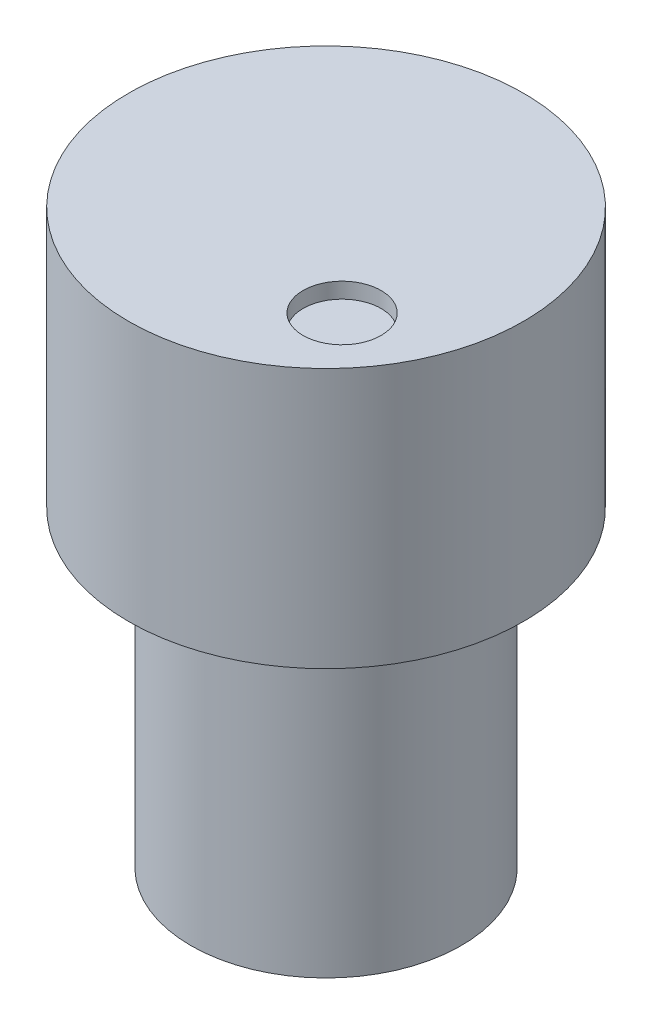
ISO-10303-21;
HEADER;
FILE_DESCRIPTION(('STEP AP214'),'2;1');
FILE_NAME('part.step','',(''),(''),'','','');
FILE_SCHEMA(('AUTOMOTIVE_DESIGN { 1 0 10303 214 1 1 1 1 }'));
ENDSEC;
DATA;
#1=APPLICATION_CONTEXT('core data for automotive mechanical design processes');
#2=APPLICATION_PROTOCOL_DEFINITION('international standard','automotive_design',2000,#1);
#3=PRODUCT_CONTEXT('',#1,'mechanical');
#4=PRODUCT('Part','Part','',(#3));
#5=PRODUCT_RELATED_PRODUCT_CATEGORY('part','',(#4));
#6=PRODUCT_DEFINITION_FORMATION('','',#4);
#7=PRODUCT_DEFINITION_CONTEXT('part definition',#1,'design');
#8=PRODUCT_DEFINITION('design','',#6,#7);
#9=PRODUCT_DEFINITION_SHAPE('','',#8);
#10=(LENGTH_UNIT() NAMED_UNIT(*) SI_UNIT(.MILLI.,.METRE.));
#11=(NAMED_UNIT(*) PLANE_ANGLE_UNIT() SI_UNIT($,.RADIAN.));
#12=(NAMED_UNIT(*) SI_UNIT($,.STERADIAN.) SOLID_ANGLE_UNIT());
#13=UNCERTAINTY_MEASURE_WITH_UNIT(LENGTH_MEASURE(1.E-05),#10,'distance_accuracy_value','');
#14=(GEOMETRIC_REPRESENTATION_CONTEXT(3) GLOBAL_UNCERTAINTY_ASSIGNED_CONTEXT((#13)) GLOBAL_UNIT_ASSIGNED_CONTEXT((#10,
#11,#12)) REPRESENTATION_CONTEXT('',''));
#15=CARTESIAN_POINT('',(0.,0.,0.));
#16=DIRECTION('',(0.,0.,1.));
#17=DIRECTION('',(1.,0.,0.));
#18=AXIS2_PLACEMENT_3D('',#15,#16,#17);
#19=CARTESIAN_POINT('',(0.,0.,0.));
#20=DIRECTION('',(0.,1.,0.));
#21=DIRECTION('',(0.,0.,1.));
#22=AXIS2_PLACEMENT_3D('',#19,#20,#21);
#23=PLANE('',#22);
#24=CARTESIAN_POINT('',(0.,0.,0.));
#25=DIRECTION('',(0.,1.,0.));
#26=DIRECTION('',(0.,0.,1.));
#27=AXIS2_PLACEMENT_3D('',#24,#25,#26);
#28=CIRCLE('',#27,5.2);
#29=CARTESIAN_POINT('',(0.,0.,5.2));
#30=VERTEX_POINT('',#29);
#31=EDGE_CURVE('E40',#30,#30,#28,.T.);
#32=ORIENTED_EDGE('',*,*,#31,.F.);
#33=EDGE_LOOP('',(#32));
#34=FACE_BOUND('',#33,.T.);
#35=CARTESIAN_POINT('',(0.,0.,0.));
#36=DIRECTION('',(0.,1.,0.));
#37=DIRECTION('',(0.,0.,1.));
#38=AXIS2_PLACEMENT_3D('',#35,#36,#37);
#39=CIRCLE('',#38,3.2);
#40=CARTESIAN_POINT('',(0.,0.,3.2));
#41=VERTEX_POINT('',#40);
#42=EDGE_CURVE('E80',#41,#41,#39,.T.);
#43=ORIENTED_EDGE('',*,*,#42,.T.);
#44=EDGE_LOOP('',(#43));
#45=FACE_BOUND('',#44,.T.);
#46=ADVANCED_FACE('F36',(#34,#45),#23,.F.);
#47=CARTESIAN_POINT('',(0.,12.,0.));
#48=DIRECTION('',(0.,-1.,0.));
#49=DIRECTION('',(0.,0.,-1.));
#50=AXIS2_PLACEMENT_3D('',#47,#48,#49);
#51=CYLINDRICAL_SURFACE('',#50,5.2);
#52=CARTESIAN_POINT('',(0.,12.,0.));
#53=DIRECTION('',(0.,1.,0.));
#54=DIRECTION('',(0.,0.,1.));
#55=AXIS2_PLACEMENT_3D('',#52,#53,#54);
#56=CIRCLE('',#55,5.2);
#57=CARTESIAN_POINT('',(0.,12.,5.2));
#58=VERTEX_POINT('',#57);
#59=EDGE_CURVE('E11',#58,#58,#56,.T.);
#60=ORIENTED_EDGE('',*,*,#59,.F.);
#61=EDGE_LOOP('',(#60));
#62=FACE_BOUND('',#61,.T.);
#63=ORIENTED_EDGE('',*,*,#31,.T.);
#64=EDGE_LOOP('',(#63));
#65=FACE_BOUND('',#64,.T.);
#66=ADVANCED_FACE('F38',(#62,#65),#51,.T.);
#67=CARTESIAN_POINT('',(0.,12.,0.));
#68=DIRECTION('',(0.,-1.,0.));
#69=DIRECTION('',(0.,0.,-1.));
#70=AXIS2_PLACEMENT_3D('',#67,#68,#69);
#71=CYLINDRICAL_SURFACE('',#70,3.2);
#72=DIRECTION('',(0.,1.,0.));
#73=VECTOR('',#72,1.);
#74=CARTESIAN_POINT('',(-2.64575131106459,7.,-1.8));
#75=LINE('',#74,#73);
#76=CARTESIAN_POINT('',(-2.64575131106459,7.,-1.8));
#77=VERTEX_POINT('',#76);
#78=CARTESIAN_POINT('',(-2.64575131106459,12.,-1.8));
#79=VERTEX_POINT('',#78);
#80=EDGE_CURVE('E66',#77,#79,#75,.T.);
#81=ORIENTED_EDGE('',*,*,#80,.T.);
#82=CARTESIAN_POINT('',(0.,12.,0.));
#83=DIRECTION('',(0.,1.,0.));
#84=DIRECTION('',(0.,0.,1.));
#85=AXIS2_PLACEMENT_3D('',#82,#83,#84);
#86=CIRCLE('',#85,3.2);
#87=CARTESIAN_POINT('',(2.64575131106459,12.,-1.8));
#88=VERTEX_POINT('',#87);
#89=EDGE_CURVE('E76',#79,#88,#86,.T.);
#90=ORIENTED_EDGE('',*,*,#89,.T.);
#91=DIRECTION('',(0.,1.,0.));
#92=VECTOR('',#91,1.);
#93=CARTESIAN_POINT('',(2.64575131106459,7.,-1.8));
#94=LINE('',#93,#92);
#95=CARTESIAN_POINT('',(2.64575131106459,7.,-1.8));
#96=VERTEX_POINT('',#95);
#97=EDGE_CURVE('E51',#96,#88,#94,.T.);
#98=ORIENTED_EDGE('',*,*,#97,.F.);
#99=CARTESIAN_POINT('',(0.,7.,0.));
#100=DIRECTION('',(0.,-1.,0.));
#101=DIRECTION('',(0.,0.,-1.));
#102=AXIS2_PLACEMENT_3D('',#99,#100,#101);
#103=CIRCLE('',#102,3.2);
#104=EDGE_CURVE('E59',#77,#96,#103,.T.);
#105=ORIENTED_EDGE('',*,*,#104,.F.);
#106=EDGE_LOOP('',(#81,#90,#98,#105));
#107=FACE_BOUND('',#106,.T.);
#108=ORIENTED_EDGE('',*,*,#42,.F.);
#109=EDGE_LOOP('',(#108));
#110=FACE_BOUND('',#109,.T.);
#111=ADVANCED_FACE('F74',(#107,#110),#71,.F.);
#112=CARTESIAN_POINT('',(0.,12.,0.));
#113=DIRECTION('',(0.,1.,0.));
#114=DIRECTION('',(0.,0.,1.));
#115=AXIS2_PLACEMENT_3D('',#112,#113,#114);
#116=PLANE('',#115);
#117=ORIENTED_EDGE('',*,*,#89,.F.);
#118=DIRECTION('',(1.,0.,0.));
#119=VECTOR('',#118,1.);
#120=CARTESIAN_POINT('',(0.,12.,-1.8));
#121=LINE('',#120,#119);
#122=EDGE_CURVE('E63',#79,#88,#121,.T.);
#123=ORIENTED_EDGE('',*,*,#122,.T.);
#124=EDGE_LOOP('',(#117,#123));
#125=FACE_BOUND('',#124,.T.);
#126=ADVANCED_FACE('F79',(#125),#116,.F.);
#127=CARTESIAN_POINT('',(0.,22.,0.));
#128=DIRECTION('',(0.,-1.,0.));
#129=DIRECTION('',(0.,0.,-1.));
#130=AXIS2_PLACEMENT_3D('',#127,#128,#129);
#131=CYLINDRICAL_SURFACE('',#130,7.6);
#132=CARTESIAN_POINT('',(0.,22.,0.));
#133=DIRECTION('',(0.,1.,0.));
#134=DIRECTION('',(0.,0.,1.));
#135=AXIS2_PLACEMENT_3D('',#132,#133,#134);
#136=CIRCLE('',#135,7.6);
#137=CARTESIAN_POINT('',(0.,22.,7.6));
#138=VERTEX_POINT('',#137);
#139=EDGE_CURVE('E81',#138,#138,#136,.T.);
#140=ORIENTED_EDGE('',*,*,#139,.F.);
#141=EDGE_LOOP('',(#140));
#142=FACE_BOUND('',#141,.T.);
#143=CARTESIAN_POINT('',(0.,12.,0.));
#144=DIRECTION('',(0.,1.,0.));
#145=DIRECTION('',(0.,0.,1.));
#146=AXIS2_PLACEMENT_3D('',#143,#144,#145);
#147=CIRCLE('',#146,7.6);
#148=CARTESIAN_POINT('',(0.,12.,7.6));
#149=VERTEX_POINT('',#148);
#150=EDGE_CURVE('E77',#149,#149,#147,.T.);
#151=ORIENTED_EDGE('',*,*,#150,.T.);
#152=EDGE_LOOP('',(#151));
#153=FACE_BOUND('',#152,.T.);
#154=ADVANCED_FACE('F112',(#142,#153),#131,.T.);
#155=CARTESIAN_POINT('',(0.,22.,0.));
#156=DIRECTION('',(0.,1.,0.));
#157=DIRECTION('',(0.,0.,1.));
#158=AXIS2_PLACEMENT_3D('',#155,#156,#157);
#159=PLANE('',#158);
#160=CARTESIAN_POINT('',(3.83022221559487,22.,3.21393804843272));
#161=DIRECTION('',(0.,1.,0.));
#162=DIRECTION('',(0.,0.,1.));
#163=AXIS2_PLACEMENT_3D('',#160,#161,#162);
#164=CIRCLE('',#163,1.5);
#165=CARTESIAN_POINT('',(3.83022221559487,22.,4.71393804843272));
#166=VERTEX_POINT('',#165);
#167=EDGE_CURVE('E93',#166,#166,#164,.T.);
#168=ORIENTED_EDGE('',*,*,#167,.F.);
#169=EDGE_LOOP('',(#168));
#170=FACE_BOUND('',#169,.T.);
#171=ORIENTED_EDGE('',*,*,#139,.T.);
#172=EDGE_LOOP('',(#171));
#173=FACE_BOUND('',#172,.T.);
#174=ADVANCED_FACE('F108',(#170,#173),#159,.T.);
#175=ORIENTED_EDGE('',*,*,#59,.T.);
#176=EDGE_LOOP('',(#175));
#177=FACE_BOUND('',#176,.T.);
#178=ORIENTED_EDGE('',*,*,#150,.F.);
#179=EDGE_LOOP('',(#178));
#180=FACE_BOUND('',#179,.T.);
#181=ADVANCED_FACE('F111',(#177,#180),#116,.F.);
#182=CARTESIAN_POINT('',(0.,7.,-1.8));
#183=DIRECTION('',(0.,0.,1.));
#184=DIRECTION('',(1.,0.,0.));
#185=AXIS2_PLACEMENT_3D('',#182,#183,#184);
#186=PLANE('',#185);
#187=ORIENTED_EDGE('',*,*,#122,.F.);
#188=ORIENTED_EDGE('',*,*,#80,.F.);
#189=DIRECTION('',(1.,0.,0.));
#190=VECTOR('',#189,1.);
#191=CARTESIAN_POINT('',(0.,7.,-1.8));
#192=LINE('',#191,#190);
#193=EDGE_CURVE('E70',#77,#96,#192,.T.);
#194=ORIENTED_EDGE('',*,*,#193,.T.);
#195=ORIENTED_EDGE('',*,*,#97,.T.);
#196=EDGE_LOOP('',(#187,#188,#194,#195));
#197=FACE_BOUND('',#196,.T.);
#198=ADVANCED_FACE('F65',(#197),#186,.T.);
#199=CARTESIAN_POINT('',(0.,7.,0.));
#200=DIRECTION('',(0.,-1.,0.));
#201=DIRECTION('',(0.,0.,-1.));
#202=AXIS2_PLACEMENT_3D('',#199,#200,#201);
#203=PLANE('',#202);
#204=ORIENTED_EDGE('',*,*,#193,.F.);
#205=ORIENTED_EDGE('',*,*,#104,.T.);
#206=EDGE_LOOP('',(#204,#205));
#207=FACE_BOUND('',#206,.T.);
#208=ADVANCED_FACE('F104',(#207),#203,.T.);
#209=CARTESIAN_POINT('',(3.83022221559487,21.4,3.21393804843272));
#210=DIRECTION('',(0.,1.,0.));
#211=DIRECTION('',(0.,0.,1.));
#212=AXIS2_PLACEMENT_3D('',#209,#210,#211);
#213=CYLINDRICAL_SURFACE('',#212,1.5);
#214=CARTESIAN_POINT('',(3.83022221559487,21.4,3.21393804843272));
#215=DIRECTION('',(0.,1.,0.));
#216=DIRECTION('',(0.,0.,1.));
#217=AXIS2_PLACEMENT_3D('',#214,#215,#216);
#218=CIRCLE('',#217,1.5);
#219=CARTESIAN_POINT('',(3.83022221559487,21.4,4.71393804843272));
#220=VERTEX_POINT('',#219);
#221=EDGE_CURVE('E71',#220,#220,#218,.T.);
#222=ORIENTED_EDGE('',*,*,#221,.F.);
#223=EDGE_LOOP('',(#222));
#224=FACE_BOUND('',#223,.T.);
#225=ORIENTED_EDGE('',*,*,#167,.T.);
#226=EDGE_LOOP('',(#225));
#227=FACE_BOUND('',#226,.T.);
#228=ADVANCED_FACE('F101',(#224,#227),#213,.F.);
#229=CARTESIAN_POINT('',(3.83022221559487,21.4,3.21393804843272));
#230=DIRECTION('',(0.,1.,0.));
#231=DIRECTION('',(0.,0.,1.));
#232=AXIS2_PLACEMENT_3D('',#229,#230,#231);
#233=PLANE('',#232);
#234=ORIENTED_EDGE('',*,*,#221,.T.);
#235=EDGE_LOOP('',(#234));
#236=FACE_BOUND('',#235,.T.);
#237=ADVANCED_FACE('F99',(#236),#233,.T.);
#238=CLOSED_SHELL('',(#46,#66,#111,#126,#154,#174,#181,#198,#208,#228,#237));
#239=MANIFOLD_SOLID_BREP('B2',#238);
#240=ADVANCED_BREP_SHAPE_REPRESENTATION('',(#18,#239),#14);
#241=SHAPE_DEFINITION_REPRESENTATION(#9,#240);
ENDSEC;
END-ISO-10303-21;
